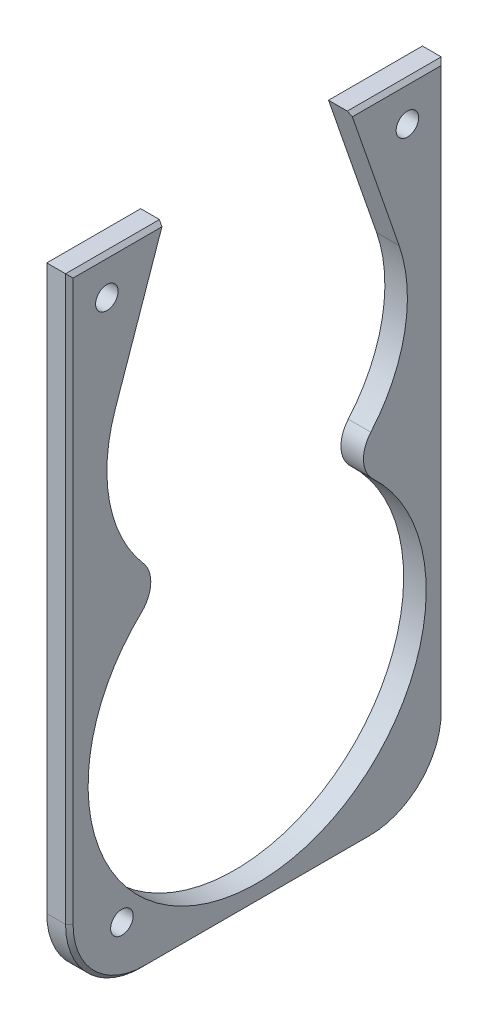
ISO-10303-21;
HEADER;
FILE_DESCRIPTION(('STEP AP214'),'2;1');
FILE_NAME('part.step','',(''),(''),'','','');
FILE_SCHEMA(('AUTOMOTIVE_DESIGN { 1 0 10303 214 1 1 1 1 }'));
ENDSEC;
DATA;
#1=APPLICATION_CONTEXT('core data for automotive mechanical design processes');
#2=APPLICATION_PROTOCOL_DEFINITION('international standard','automotive_design',2000,#1);
#3=PRODUCT_CONTEXT('',#1,'mechanical');
#4=PRODUCT('Part','Part','',(#3));
#5=PRODUCT_RELATED_PRODUCT_CATEGORY('part','',(#4));
#6=PRODUCT_DEFINITION_FORMATION('','',#4);
#7=PRODUCT_DEFINITION_CONTEXT('part definition',#1,'design');
#8=PRODUCT_DEFINITION('design','',#6,#7);
#9=PRODUCT_DEFINITION_SHAPE('','',#8);
#10=(LENGTH_UNIT() NAMED_UNIT(*) SI_UNIT(.MILLI.,.METRE.));
#11=(NAMED_UNIT(*) PLANE_ANGLE_UNIT() SI_UNIT($,.RADIAN.));
#12=(NAMED_UNIT(*) SI_UNIT($,.STERADIAN.) SOLID_ANGLE_UNIT());
#13=UNCERTAINTY_MEASURE_WITH_UNIT(LENGTH_MEASURE(1.E-05),#10,'distance_accuracy_value','');
#14=(GEOMETRIC_REPRESENTATION_CONTEXT(3) GLOBAL_UNCERTAINTY_ASSIGNED_CONTEXT((#13)) GLOBAL_UNIT_ASSIGNED_CONTEXT((#10,
#11,#12)) REPRESENTATION_CONTEXT('',''));
#15=CARTESIAN_POINT('',(0.,0.,0.));
#16=DIRECTION('',(0.,0.,1.));
#17=DIRECTION('',(1.,0.,0.));
#18=AXIS2_PLACEMENT_3D('',#15,#16,#17);
#19=CARTESIAN_POINT('',(0.,25.,0.));
#20=DIRECTION('',(1.,0.,0.));
#21=DIRECTION('',(0.,0.,-1.));
#22=AXIS2_PLACEMENT_3D('',#19,#20,#21);
#23=CYLINDRICAL_SURFACE('',#22,20.);
#24=CARTESIAN_POINT('',(0.,25.,0.));
#25=DIRECTION('',(1.,0.,0.));
#26=DIRECTION('',(0.,0.,-1.));
#27=AXIS2_PLACEMENT_3D('',#24,#25,#26);
#28=CIRCLE('',#27,20.);
#29=CARTESIAN_POINT('',(0.,11.9196428571429,-15.1295821824433));
#30=VERTEX_POINT('',#29);
#31=CARTESIAN_POINT('',(0.,31.5518002592747,-18.8963994814506));
#32=VERTEX_POINT('',#31);
#33=EDGE_CURVE('E195',#30,#32,#28,.T.);
#34=ORIENTED_EDGE('',*,*,#33,.F.);
#35=DIRECTION('',(1.,0.,0.));
#36=VECTOR('',#35,1.);
#37=CARTESIAN_POINT('',(0.,11.9196428571429,-15.1295821824433));
#38=LINE('',#37,#36);
#39=CARTESIAN_POINT('',(3.,11.9196428571429,-15.1295821824433));
#40=VERTEX_POINT('',#39);
#41=EDGE_CURVE('E11',#30,#40,#38,.T.);
#42=ORIENTED_EDGE('',*,*,#41,.T.);
#43=CARTESIAN_POINT('',(3.,25.,0.));
#44=DIRECTION('',(1.,0.,0.));
#45=DIRECTION('',(0.,0.,-1.));
#46=AXIS2_PLACEMENT_3D('',#43,#44,#45);
#47=CIRCLE('',#46,20.);
#48=CARTESIAN_POINT('',(3.,31.5518002592747,-18.8963994814506));
#49=VERTEX_POINT('',#48);
#50=EDGE_CURVE('E218',#40,#49,#47,.T.);
#51=ORIENTED_EDGE('',*,*,#50,.T.);
#52=DIRECTION('',(1.,0.,0.));
#53=VECTOR('',#52,1.);
#54=CARTESIAN_POINT('',(0.,31.5518002592747,-18.8963994814506));
#55=LINE('',#54,#53);
#56=EDGE_CURVE('E184',#32,#49,#55,.T.);
#57=ORIENTED_EDGE('',*,*,#56,.F.);
#58=EDGE_LOOP('',(#34,#42,#51,#57));
#59=FACE_BOUND('',#58,.T.);
#60=ADVANCED_FACE('F47',(#59),#23,.F.);
#61=CARTESIAN_POINT('',(3.,50.,25.));
#62=DIRECTION('',(0.,-1.,0.));
#63=DIRECTION('',(0.,0.,-1.));
#64=AXIS2_PLACEMENT_3D('',#61,#62,#63);
#65=PLANE('',#64);
#66=DIRECTION('',(0.,0.,-1.));
#67=VECTOR('',#66,1.);
#68=CARTESIAN_POINT('',(2.49999999999999,50.,-25.));
#69=LINE('',#68,#67);
#70=CARTESIAN_POINT('',(2.49999999999999,50.,25.));
#71=VERTEX_POINT('',#70);
#72=CARTESIAN_POINT('',(2.49999999999999,50.,12.5));
#73=VERTEX_POINT('',#72);
#74=EDGE_CURVE('E336',#71,#73,#69,.T.);
#75=ORIENTED_EDGE('',*,*,#74,.T.);
#76=DIRECTION('',(1.,0.,0.));
#77=VECTOR('',#76,1.);
#78=CARTESIAN_POINT('',(0.,50.,12.5));
#79=LINE('',#78,#77);
#80=CARTESIAN_POINT('',(0.,50.,12.5));
#81=VERTEX_POINT('',#80);
#82=EDGE_CURVE('E222',#81,#73,#79,.T.);
#83=ORIENTED_EDGE('',*,*,#82,.F.);
#84=DIRECTION('',(0.,0.,1.));
#85=VECTOR('',#84,1.);
#86=CARTESIAN_POINT('',(0.,50.,25.));
#87=LINE('',#86,#85);
#88=CARTESIAN_POINT('',(0.,50.,25.));
#89=VERTEX_POINT('',#88);
#90=EDGE_CURVE('E201',#81,#89,#87,.T.);
#91=ORIENTED_EDGE('',*,*,#90,.T.);
#92=DIRECTION('',(-1.,0.,0.));
#93=VECTOR('',#92,1.);
#94=CARTESIAN_POINT('',(3.,50.,25.));
#95=LINE('',#94,#93);
#96=EDGE_CURVE('E274',#71,#89,#95,.T.);
#97=ORIENTED_EDGE('',*,*,#96,.F.);
#98=EDGE_LOOP('',(#75,#83,#91,#97));
#99=FACE_BOUND('',#98,.T.);
#100=ADVANCED_FACE('F461',(#99),#65,.F.);
#101=CARTESIAN_POINT('',(3.,49.5,0.));
#102=DIRECTION('',(0.707106781186535,0.70710678118656,0.));
#103=DIRECTION('',(0.,0.,-1.));
#104=AXIS2_PLACEMENT_3D('',#101,#102,#103);
#105=PLANE('',#104);
#106=DIRECTION('',(0.686767793950055,-0.686767793950032,0.238117606207481));
#107=VECTOR('',#106,1.);
#108=CARTESIAN_POINT('',(0.927506213859762,51.5724937861402,11.954781573291));
#109=LINE('',#108,#107);
#110=CARTESIAN_POINT('',(3.,49.5,12.6733610751007));
#111=VERTEX_POINT('',#110);
#112=EDGE_CURVE('E366',#73,#111,#109,.T.);
#113=ORIENTED_EDGE('',*,*,#112,.F.);
#114=ORIENTED_EDGE('',*,*,#74,.F.);
#115=DIRECTION('',(-0.577350269189638,0.577350269189618,0.577350269189621));
#116=VECTOR('',#115,1.);
#117=CARTESIAN_POINT('',(19.5000000000001,33.0000000000005,8.00000000000035));
#118=LINE('',#117,#116);
#119=CARTESIAN_POINT('',(3.,49.5,24.5));
#120=VERTEX_POINT('',#119);
#121=EDGE_CURVE('E349',#71,#120,#118,.F.);
#122=ORIENTED_EDGE('',*,*,#121,.T.);
#123=DIRECTION('',(0.,0.,1.));
#124=VECTOR('',#123,1.);
#125=CARTESIAN_POINT('',(3.,49.5,25.));
#126=LINE('',#125,#124);
#127=EDGE_CURVE('E304',#111,#120,#126,.T.);
#128=ORIENTED_EDGE('',*,*,#127,.F.);
#129=EDGE_LOOP('',(#113,#114,#122,#128));
#130=FACE_BOUND('',#129,.T.);
#131=ADVANCED_FACE('F468',(#130),#105,.T.);
#132=CARTESIAN_POINT('',(3.,50.,25.));
#133=DIRECTION('',(0.,0.,-1.));
#134=DIRECTION('',(0.,1.,0.));
#135=AXIS2_PLACEMENT_3D('',#132,#133,#134);
#136=PLANE('',#135);
#137=DIRECTION('',(-1.,0.,0.));
#138=VECTOR('',#137,1.);
#139=CARTESIAN_POINT('',(3.,-25.,25.));
#140=LINE('',#139,#138);
#141=CARTESIAN_POINT('',(0.,-25.,25.));
#142=VERTEX_POINT('',#141);
#143=CARTESIAN_POINT('',(2.49999999999999,-25.,25.));
#144=VERTEX_POINT('',#143);
#145=EDGE_CURVE('E297',#142,#144,#140,.F.);
#146=ORIENTED_EDGE('',*,*,#145,.T.);
#147=DIRECTION('',(0.,1.,0.));
#148=VECTOR('',#147,1.);
#149=CARTESIAN_POINT('',(2.49999999999999,50.,25.));
#150=LINE('',#149,#148);
#151=EDGE_CURVE('E340',#144,#71,#150,.T.);
#152=ORIENTED_EDGE('',*,*,#151,.T.);
#153=ORIENTED_EDGE('',*,*,#96,.T.);
#154=DIRECTION('',(0.,-1.,0.));
#155=VECTOR('',#154,1.);
#156=CARTESIAN_POINT('',(0.,50.,25.));
#157=LINE('',#156,#155);
#158=EDGE_CURVE('E237',#89,#142,#157,.T.);
#159=ORIENTED_EDGE('',*,*,#158,.T.);
#160=EDGE_LOOP('',(#146,#152,#153,#159));
#161=FACE_BOUND('',#160,.T.);
#162=ADVANCED_FACE('F459',(#161),#136,.F.);
#163=CARTESIAN_POINT('',(3.,-35.,25.));
#164=DIRECTION('',(0.,1.,0.));
#165=DIRECTION('',(0.,0.,1.));
#166=AXIS2_PLACEMENT_3D('',#163,#164,#165);
#167=PLANE('',#166);
#168=DIRECTION('',(-1.,0.,0.));
#169=VECTOR('',#168,1.);
#170=CARTESIAN_POINT('',(3.,-35.,-15.));
#171=LINE('',#170,#169);
#172=CARTESIAN_POINT('',(0.,-35.,-15.));
#173=VERTEX_POINT('',#172);
#174=CARTESIAN_POINT('',(2.49999999999999,-35.,-15.));
#175=VERTEX_POINT('',#174);
#176=EDGE_CURVE('E293',#173,#175,#171,.F.);
#177=ORIENTED_EDGE('',*,*,#176,.T.);
#178=DIRECTION('',(0.,0.,1.));
#179=VECTOR('',#178,1.);
#180=CARTESIAN_POINT('',(2.49999999999999,-35.,15.));
#181=LINE('',#180,#179);
#182=CARTESIAN_POINT('',(2.49999999999999,-35.,15.));
#183=VERTEX_POINT('',#182);
#184=EDGE_CURVE('E329',#175,#183,#181,.T.);
#185=ORIENTED_EDGE('',*,*,#184,.T.);
#186=DIRECTION('',(-1.,0.,0.));
#187=VECTOR('',#186,1.);
#188=CARTESIAN_POINT('',(3.,-35.,15.));
#189=LINE('',#188,#187);
#190=CARTESIAN_POINT('',(0.,-35.,15.));
#191=VERTEX_POINT('',#190);
#192=EDGE_CURVE('E290',#183,#191,#189,.T.);
#193=ORIENTED_EDGE('',*,*,#192,.T.);
#194=DIRECTION('',(0.,0.,-1.));
#195=VECTOR('',#194,1.);
#196=CARTESIAN_POINT('',(0.,-35.,25.));
#197=LINE('',#196,#195);
#198=EDGE_CURVE('E262',#191,#173,#197,.T.);
#199=ORIENTED_EDGE('',*,*,#198,.T.);
#200=EDGE_LOOP('',(#177,#185,#193,#199));
#201=FACE_BOUND('',#200,.T.);
#202=ADVANCED_FACE('F420',(#201),#167,.F.);
#203=CARTESIAN_POINT('',(3.,50.,-25.));
#204=DIRECTION('',(0.,0.,1.));
#205=DIRECTION('',(0.,-1.,0.));
#206=AXIS2_PLACEMENT_3D('',#203,#204,#205);
#207=PLANE('',#206);
#208=DIRECTION('',(-1.,0.,0.));
#209=VECTOR('',#208,1.);
#210=CARTESIAN_POINT('',(3.,50.,-25.));
#211=LINE('',#210,#209);
#212=CARTESIAN_POINT('',(2.49999999999999,50.,-25.));
#213=VERTEX_POINT('',#212);
#214=CARTESIAN_POINT('',(0.,50.,-25.));
#215=VERTEX_POINT('',#214);
#216=EDGE_CURVE('E278',#213,#215,#211,.T.);
#217=ORIENTED_EDGE('',*,*,#216,.F.);
#218=DIRECTION('',(0.,-1.,0.));
#219=VECTOR('',#218,1.);
#220=CARTESIAN_POINT('',(2.49999999999999,-25.,-25.));
#221=LINE('',#220,#219);
#222=CARTESIAN_POINT('',(2.49999999999999,-25.,-25.));
#223=VERTEX_POINT('',#222);
#224=EDGE_CURVE('E322',#213,#223,#221,.T.);
#225=ORIENTED_EDGE('',*,*,#224,.T.);
#226=DIRECTION('',(-1.,0.,0.));
#227=VECTOR('',#226,1.);
#228=CARTESIAN_POINT('',(3.,-25.,-25.));
#229=LINE('',#228,#227);
#230=CARTESIAN_POINT('',(0.,-25.,-25.));
#231=VERTEX_POINT('',#230);
#232=EDGE_CURVE('E281',#223,#231,#229,.T.);
#233=ORIENTED_EDGE('',*,*,#232,.T.);
#234=DIRECTION('',(0.,1.,0.));
#235=VECTOR('',#234,1.);
#236=CARTESIAN_POINT('',(0.,50.,-25.));
#237=LINE('',#236,#235);
#238=EDGE_CURVE('E266',#231,#215,#237,.T.);
#239=ORIENTED_EDGE('',*,*,#238,.T.);
#240=EDGE_LOOP('',(#217,#225,#233,#239));
#241=FACE_BOUND('',#240,.T.);
#242=ADVANCED_FACE('F413',(#241),#207,.F.);
#243=CARTESIAN_POINT('',(0.,50.,-12.5));
#244=VERTEX_POINT('',#243);
#245=EDGE_CURVE('E270',#215,#244,#87,.T.);
#246=ORIENTED_EDGE('',*,*,#245,.T.);
#247=DIRECTION('',(1.,0.,0.));
#248=VECTOR('',#247,1.);
#249=CARTESIAN_POINT('',(0.,50.,-12.5));
#250=LINE('',#249,#248);
#251=CARTESIAN_POINT('',(2.49999999999999,50.,-12.5));
#252=VERTEX_POINT('',#251);
#253=EDGE_CURVE('E226',#244,#252,#250,.T.);
#254=ORIENTED_EDGE('',*,*,#253,.T.);
#255=EDGE_CURVE('E335',#252,#213,#69,.T.);
#256=ORIENTED_EDGE('',*,*,#255,.T.);
#257=ORIENTED_EDGE('',*,*,#216,.T.);
#258=EDGE_LOOP('',(#246,#254,#256,#257));
#259=FACE_BOUND('',#258,.T.);
#260=ADVANCED_FACE('F408',(#259),#65,.F.);
#261=CARTESIAN_POINT('',(3.,0.,0.));
#262=DIRECTION('',(1.,0.,0.));
#263=DIRECTION('',(0.,0.,-1.));
#264=AXIS2_PLACEMENT_3D('',#261,#262,#263);
#265=PLANE('',#264);
#266=CARTESIAN_POINT('',(3.,-10.,0.));
#267=DIRECTION('',(1.,0.,0.));
#268=DIRECTION('',(0.,0.,-1.));
#269=AXIS2_PLACEMENT_3D('',#266,#267,#268);
#270=CIRCLE('',#269,22.5);
#271=CARTESIAN_POINT('',(3.,6.38982479784366,15.4150459972064));
#272=VERTEX_POINT('',#271);
#273=CARTESIAN_POINT('',(3.,6.38982479784367,-15.4150459972064));
#274=VERTEX_POINT('',#273);
#275=EDGE_CURVE('E210',#272,#274,#270,.T.);
#276=ORIENTED_EDGE('',*,*,#275,.F.);
#277=CARTESIAN_POINT('',(3.,9.30357142857142,18.155498618932));
#278=DIRECTION('',(1.,0.,0.));
#279=DIRECTION('',(0.,0.,-1.));
#280=AXIS2_PLACEMENT_3D('',#277,#278,#279);
#281=CIRCLE('',#280,4.);
#282=CARTESIAN_POINT('',(3.,11.9196428571429,15.1295821824433));
#283=VERTEX_POINT('',#282);
#284=EDGE_CURVE('E56',#272,#283,#281,.T.);
#285=ORIENTED_EDGE('',*,*,#284,.T.);
#286=CARTESIAN_POINT('',(3.,31.5518002592747,18.8963994814507));
#287=VERTEX_POINT('',#286);
#288=EDGE_CURVE('E207',#287,#283,#47,.T.);
#289=ORIENTED_EDGE('',*,*,#288,.F.);
#290=DIRECTION('',(0.,-0.944819974072532,0.327590012963734));
#291=VECTOR('',#290,1.);
#292=CARTESIAN_POINT('',(3.,50.,12.5));
#293=LINE('',#292,#291);
#294=EDGE_CURVE('E179',#111,#287,#293,.T.);
#295=ORIENTED_EDGE('',*,*,#294,.F.);
#296=ORIENTED_EDGE('',*,*,#127,.T.);
#297=DIRECTION('',(0.,-1.,0.));
#298=VECTOR('',#297,1.);
#299=CARTESIAN_POINT('',(3.,-25.,24.5));
#300=LINE('',#299,#298);
#301=CARTESIAN_POINT('',(3.,-25.,24.5));
#302=VERTEX_POINT('',#301);
#303=EDGE_CURVE('E301',#120,#302,#300,.T.);
#304=ORIENTED_EDGE('',*,*,#303,.T.);
#305=CARTESIAN_POINT('',(3.,-25.,15.));
#306=DIRECTION('',(1.,0.,0.));
#307=DIRECTION('',(0.,0.,-1.));
#308=AXIS2_PLACEMENT_3D('',#305,#306,#307);
#309=CIRCLE('',#308,9.5);
#310=CARTESIAN_POINT('',(3.,-34.5,15.));
#311=VERTEX_POINT('',#310);
#312=EDGE_CURVE('E309',#302,#311,#309,.T.);
#313=ORIENTED_EDGE('',*,*,#312,.T.);
#314=DIRECTION('',(0.,0.,-1.));
#315=VECTOR('',#314,1.);
#316=CARTESIAN_POINT('',(3.,-34.5,-15.));
#317=LINE('',#316,#315);
#318=CARTESIAN_POINT('',(3.,-34.5,-15.));
#319=VERTEX_POINT('',#318);
#320=EDGE_CURVE('E312',#311,#319,#317,.T.);
#321=ORIENTED_EDGE('',*,*,#320,.T.);
#322=CARTESIAN_POINT('',(3.,-25.,-15.));
#323=DIRECTION('',(1.,0.,0.));
#324=DIRECTION('',(0.,0.,-1.));
#325=AXIS2_PLACEMENT_3D('',#322,#323,#324);
#326=CIRCLE('',#325,9.5);
#327=CARTESIAN_POINT('',(3.,-25.,-24.5));
#328=VERTEX_POINT('',#327);
#329=EDGE_CURVE('E315',#319,#328,#326,.T.);
#330=ORIENTED_EDGE('',*,*,#329,.T.);
#331=DIRECTION('',(0.,1.,0.));
#332=VECTOR('',#331,1.);
#333=CARTESIAN_POINT('',(3.,50.,-24.5));
#334=LINE('',#333,#332);
#335=CARTESIAN_POINT('',(3.,49.5,-24.5));
#336=VERTEX_POINT('',#335);
#337=EDGE_CURVE('E318',#328,#336,#334,.T.);
#338=ORIENTED_EDGE('',*,*,#337,.T.);
#339=CARTESIAN_POINT('',(3.,49.5,-12.6733610751007));
#340=VERTEX_POINT('',#339);
#341=EDGE_CURVE('E305',#336,#340,#126,.T.);
#342=ORIENTED_EDGE('',*,*,#341,.T.);
#343=DIRECTION('',(0.,0.944819974072532,0.327590012963734));
#344=VECTOR('',#343,1.);
#345=CARTESIAN_POINT('',(3.,31.5518002592747,-18.8963994814506));
#346=LINE('',#345,#344);
#347=EDGE_CURVE('E203',#49,#340,#346,.T.);
#348=ORIENTED_EDGE('',*,*,#347,.F.);
#349=ORIENTED_EDGE('',*,*,#50,.F.);
#350=CARTESIAN_POINT('',(3.,9.30357142857143,-18.155498618932));
#351=DIRECTION('',(1.,0.,0.));
#352=DIRECTION('',(0.,0.,-1.));
#353=AXIS2_PLACEMENT_3D('',#350,#351,#352);
#354=CIRCLE('',#353,4.);
#355=EDGE_CURVE('E63',#40,#274,#354,.T.);
#356=ORIENTED_EDGE('',*,*,#355,.T.);
#357=EDGE_LOOP('',(#276,#285,#289,#295,#296,#304,#313,#321,#330,#338,#342,#348,#349,#356));
#358=FACE_BOUND('',#357,.T.);
#359=CARTESIAN_POINT('',(3.,45.,-20.));
#360=DIRECTION('',(1.,0.,0.));
#361=DIRECTION('',(0.,0.,-1.));
#362=AXIS2_PLACEMENT_3D('',#359,#360,#361);
#363=CIRCLE('',#362,1.5);
#364=CARTESIAN_POINT('',(3.,45.,-21.5));
#365=VERTEX_POINT('',#364);
#366=EDGE_CURVE('E238',#365,#365,#363,.T.);
#367=ORIENTED_EDGE('',*,*,#366,.F.);
#368=EDGE_LOOP('',(#367));
#369=FACE_BOUND('',#368,.T.);
#370=CARTESIAN_POINT('',(3.,45.,20.));
#371=DIRECTION('',(1.,0.,0.));
#372=DIRECTION('',(0.,0.,-1.));
#373=AXIS2_PLACEMENT_3D('',#370,#371,#372);
#374=CIRCLE('',#373,1.5);
#375=CARTESIAN_POINT('',(3.,45.,18.5));
#376=VERTEX_POINT('',#375);
#377=EDGE_CURVE('E242',#376,#376,#374,.T.);
#378=ORIENTED_EDGE('',*,*,#377,.F.);
#379=EDGE_LOOP('',(#378));
#380=FACE_BOUND('',#379,.T.);
#381=CARTESIAN_POINT('',(3.,-28.,18.));
#382=DIRECTION('',(1.,0.,0.));
#383=DIRECTION('',(0.,0.,-1.));
#384=AXIS2_PLACEMENT_3D('',#381,#382,#383);
#385=CIRCLE('',#384,1.5);
#386=CARTESIAN_POINT('',(3.,-28.,16.5));
#387=VERTEX_POINT('',#386);
#388=EDGE_CURVE('E250',#387,#387,#385,.T.);
#389=ORIENTED_EDGE('',*,*,#388,.F.);
#390=EDGE_LOOP('',(#389));
#391=FACE_BOUND('',#390,.T.);
#392=ADVANCED_FACE('F386',(#358,#369,#380,#391),#265,.T.);
#393=CARTESIAN_POINT('',(0.,0.,0.));
#394=DIRECTION('',(1.,0.,0.));
#395=DIRECTION('',(0.,0.,-1.));
#396=AXIS2_PLACEMENT_3D('',#393,#394,#395);
#397=PLANE('',#396);
#398=CARTESIAN_POINT('',(0.,31.5518002592747,18.8963994814507));
#399=VERTEX_POINT('',#398);
#400=CARTESIAN_POINT('',(0.,11.9196428571429,15.1295821824433));
#401=VERTEX_POINT('',#400);
#402=EDGE_CURVE('E189',#399,#401,#28,.T.);
#403=ORIENTED_EDGE('',*,*,#402,.T.);
#404=CARTESIAN_POINT('',(0.,9.30357142857142,18.155498618932));
#405=DIRECTION('',(1.,0.,0.));
#406=DIRECTION('',(0.,0.,-1.));
#407=AXIS2_PLACEMENT_3D('',#404,#405,#406);
#408=CIRCLE('',#407,4.);
#409=CARTESIAN_POINT('',(0.,6.38982479784366,15.4150459972064));
#410=VERTEX_POINT('',#409);
#411=EDGE_CURVE('E374',#401,#410,#408,.F.);
#412=ORIENTED_EDGE('',*,*,#411,.T.);
#413=CARTESIAN_POINT('',(0.,-10.,0.));
#414=DIRECTION('',(1.,0.,0.));
#415=DIRECTION('',(0.,0.,-1.));
#416=AXIS2_PLACEMENT_3D('',#413,#414,#415);
#417=CIRCLE('',#416,22.5);
#418=CARTESIAN_POINT('',(0.,6.38982479784367,-15.4150459972064));
#419=VERTEX_POINT('',#418);
#420=EDGE_CURVE('E219',#410,#419,#417,.T.);
#421=ORIENTED_EDGE('',*,*,#420,.T.);
#422=CARTESIAN_POINT('',(0.,9.30357142857143,-18.155498618932));
#423=DIRECTION('',(1.,0.,0.));
#424=DIRECTION('',(0.,0.,-1.));
#425=AXIS2_PLACEMENT_3D('',#422,#423,#424);
#426=CIRCLE('',#425,4.);
#427=EDGE_CURVE('E371',#419,#30,#426,.F.);
#428=ORIENTED_EDGE('',*,*,#427,.T.);
#429=ORIENTED_EDGE('',*,*,#33,.T.);
#430=DIRECTION('',(0.,0.944819974072532,0.327590012963734));
#431=VECTOR('',#430,1.);
#432=CARTESIAN_POINT('',(0.,31.5518002592747,-18.8963994814506));
#433=LINE('',#432,#431);
#434=EDGE_CURVE('E185',#32,#244,#433,.T.);
#435=ORIENTED_EDGE('',*,*,#434,.T.);
#436=ORIENTED_EDGE('',*,*,#245,.F.);
#437=ORIENTED_EDGE('',*,*,#238,.F.);
#438=CARTESIAN_POINT('',(0.,-25.,-15.));
#439=DIRECTION('',(1.,0.,0.));
#440=DIRECTION('',(0.,0.,-1.));
#441=AXIS2_PLACEMENT_3D('',#438,#439,#440);
#442=CIRCLE('',#441,10.);
#443=EDGE_CURVE('E287',#231,#173,#442,.F.);
#444=ORIENTED_EDGE('',*,*,#443,.T.);
#445=ORIENTED_EDGE('',*,*,#198,.F.);
#446=CARTESIAN_POINT('',(0.,-25.,15.));
#447=DIRECTION('',(1.,0.,0.));
#448=DIRECTION('',(0.,0.,-1.));
#449=AXIS2_PLACEMENT_3D('',#446,#447,#448);
#450=CIRCLE('',#449,10.);
#451=EDGE_CURVE('E284',#191,#142,#450,.F.);
#452=ORIENTED_EDGE('',*,*,#451,.T.);
#453=ORIENTED_EDGE('',*,*,#158,.F.);
#454=ORIENTED_EDGE('',*,*,#90,.F.);
#455=DIRECTION('',(0.,-0.944819974072532,0.327590012963734));
#456=VECTOR('',#455,1.);
#457=CARTESIAN_POINT('',(0.,50.,12.5));
#458=LINE('',#457,#456);
#459=EDGE_CURVE('E176',#81,#399,#458,.T.);
#460=ORIENTED_EDGE('',*,*,#459,.T.);
#461=EDGE_LOOP('',(#403,#412,#421,#428,#429,#435,#436,#437,#444,#445,#452,#453,#454,#460));
#462=FACE_BOUND('',#461,.T.);
#463=CARTESIAN_POINT('',(0.,45.,-20.));
#464=DIRECTION('',(1.,0.,0.));
#465=DIRECTION('',(0.,0.,-1.));
#466=AXIS2_PLACEMENT_3D('',#463,#464,#465);
#467=CIRCLE('',#466,1.5);
#468=CARTESIAN_POINT('',(0.,45.,-21.5));
#469=VERTEX_POINT('',#468);
#470=EDGE_CURVE('E233',#469,#469,#467,.T.);
#471=ORIENTED_EDGE('',*,*,#470,.T.);
#472=EDGE_LOOP('',(#471));
#473=FACE_BOUND('',#472,.T.);
#474=CARTESIAN_POINT('',(0.,45.,20.));
#475=DIRECTION('',(1.,0.,0.));
#476=DIRECTION('',(0.,0.,-1.));
#477=AXIS2_PLACEMENT_3D('',#474,#475,#476);
#478=CIRCLE('',#477,1.5);
#479=CARTESIAN_POINT('',(0.,45.,18.5));
#480=VERTEX_POINT('',#479);
#481=EDGE_CURVE('E246',#480,#480,#478,.T.);
#482=ORIENTED_EDGE('',*,*,#481,.T.);
#483=EDGE_LOOP('',(#482));
#484=FACE_BOUND('',#483,.T.);
#485=CARTESIAN_POINT('',(0.,-28.,18.));
#486=DIRECTION('',(1.,0.,0.));
#487=DIRECTION('',(0.,0.,-1.));
#488=AXIS2_PLACEMENT_3D('',#485,#486,#487);
#489=CIRCLE('',#488,1.5);
#490=CARTESIAN_POINT('',(0.,-28.,16.5));
#491=VERTEX_POINT('',#490);
#492=EDGE_CURVE('E254',#491,#491,#489,.T.);
#493=ORIENTED_EDGE('',*,*,#492,.T.);
#494=EDGE_LOOP('',(#493));
#495=FACE_BOUND('',#494,.T.);
#496=ADVANCED_FACE('F198',(#462,#473,#484,#495),#397,.F.);
#497=CARTESIAN_POINT('',(3.,-25.,-15.));
#498=DIRECTION('',(-1.,0.,0.));
#499=DIRECTION('',(0.,0.,1.));
#500=AXIS2_PLACEMENT_3D('',#497,#498,#499);
#501=CYLINDRICAL_SURFACE('',#500,10.);
#502=ORIENTED_EDGE('',*,*,#232,.F.);
#503=CARTESIAN_POINT('',(2.49999999999999,-25.,-15.));
#504=DIRECTION('',(1.,0.,0.));
#505=DIRECTION('',(0.,0.,-1.));
#506=AXIS2_PLACEMENT_3D('',#503,#504,#505);
#507=CIRCLE('',#506,10.);
#508=EDGE_CURVE('E326',#223,#175,#507,.F.);
#509=ORIENTED_EDGE('',*,*,#508,.T.);
#510=ORIENTED_EDGE('',*,*,#176,.F.);
#511=ORIENTED_EDGE('',*,*,#443,.F.);
#512=EDGE_LOOP('',(#502,#509,#510,#511));
#513=FACE_BOUND('',#512,.T.);
#514=ADVANCED_FACE('F424',(#513),#501,.T.);
#515=CARTESIAN_POINT('',(3.,-25.,15.));
#516=DIRECTION('',(-1.,0.,0.));
#517=DIRECTION('',(0.,0.,1.));
#518=AXIS2_PLACEMENT_3D('',#515,#516,#517);
#519=CYLINDRICAL_SURFACE('',#518,10.);
#520=ORIENTED_EDGE('',*,*,#192,.F.);
#521=CARTESIAN_POINT('',(2.49999999999999,-25.,15.));
#522=DIRECTION('',(1.,0.,0.));
#523=DIRECTION('',(0.,0.,-1.));
#524=AXIS2_PLACEMENT_3D('',#521,#522,#523);
#525=CIRCLE('',#524,10.);
#526=EDGE_CURVE('E332',#183,#144,#525,.F.);
#527=ORIENTED_EDGE('',*,*,#526,.T.);
#528=ORIENTED_EDGE('',*,*,#145,.F.);
#529=ORIENTED_EDGE('',*,*,#451,.F.);
#530=EDGE_LOOP('',(#520,#527,#528,#529));
#531=FACE_BOUND('',#530,.T.);
#532=ADVANCED_FACE('F446',(#531),#519,.T.);
#533=CARTESIAN_POINT('',(0.,-28.,18.));
#534=DIRECTION('',(1.,0.,0.));
#535=DIRECTION('',(0.,0.,-1.));
#536=AXIS2_PLACEMENT_3D('',#533,#534,#535);
#537=CYLINDRICAL_SURFACE('',#536,1.5);
#538=ORIENTED_EDGE('',*,*,#492,.F.);
#539=EDGE_LOOP('',(#538));
#540=FACE_BOUND('',#539,.T.);
#541=ORIENTED_EDGE('',*,*,#388,.T.);
#542=EDGE_LOOP('',(#541));
#543=FACE_BOUND('',#542,.T.);
#544=ADVANCED_FACE('F510',(#540,#543),#537,.F.);
#545=CARTESIAN_POINT('',(0.,45.,20.));
#546=DIRECTION('',(1.,0.,0.));
#547=DIRECTION('',(0.,0.,-1.));
#548=AXIS2_PLACEMENT_3D('',#545,#546,#547);
#549=CYLINDRICAL_SURFACE('',#548,1.5);
#550=ORIENTED_EDGE('',*,*,#481,.F.);
#551=EDGE_LOOP('',(#550));
#552=FACE_BOUND('',#551,.T.);
#553=ORIENTED_EDGE('',*,*,#377,.T.);
#554=EDGE_LOOP('',(#553));
#555=FACE_BOUND('',#554,.T.);
#556=ADVANCED_FACE('F506',(#552,#555),#549,.F.);
#557=CARTESIAN_POINT('',(0.,45.,-20.));
#558=DIRECTION('',(1.,0.,0.));
#559=DIRECTION('',(0.,0.,-1.));
#560=AXIS2_PLACEMENT_3D('',#557,#558,#559);
#561=CYLINDRICAL_SURFACE('',#560,1.5);
#562=ORIENTED_EDGE('',*,*,#470,.F.);
#563=EDGE_LOOP('',(#562));
#564=FACE_BOUND('',#563,.T.);
#565=ORIENTED_EDGE('',*,*,#366,.T.);
#566=EDGE_LOOP('',(#565));
#567=FACE_BOUND('',#566,.T.);
#568=ADVANCED_FACE('F503',(#564,#567),#561,.F.);
#569=CARTESIAN_POINT('',(3.,-25.,15.));
#570=DIRECTION('',(-1.,0.,0.));
#571=DIRECTION('',(0.,0.,1.));
#572=AXIS2_PLACEMENT_3D('',#569,#570,#571);
#573=CONICAL_SURFACE('',#572,9.5,0.785398163397435);
#574=DIRECTION('',(0.707106781186557,0.,-0.707106781186538));
#575=VECTOR('',#574,1.);
#576=CARTESIAN_POINT('',(2.49999999999999,-25.,25.));
#577=LINE('',#576,#575);
#578=EDGE_CURVE('E357',#144,#302,#577,.T.);
#579=ORIENTED_EDGE('',*,*,#578,.F.);
#580=ORIENTED_EDGE('',*,*,#526,.F.);
#581=DIRECTION('',(-0.707106781186557,-0.707106781186538,0.));
#582=VECTOR('',#581,1.);
#583=CARTESIAN_POINT('',(3.,-34.5,15.));
#584=LINE('',#583,#582);
#585=EDGE_CURVE('E258',#311,#183,#584,.T.);
#586=ORIENTED_EDGE('',*,*,#585,.F.);
#587=ORIENTED_EDGE('',*,*,#312,.F.);
#588=EDGE_LOOP('',(#579,#580,#586,#587));
#589=FACE_BOUND('',#588,.T.);
#590=ADVANCED_FACE('F450',(#589),#573,.T.);
#591=CARTESIAN_POINT('',(3.,-34.5,0.));
#592=DIRECTION('',(0.707106781186538,-0.707106781186557,0.));
#593=DIRECTION('',(0.,0.,1.));
#594=AXIS2_PLACEMENT_3D('',#591,#592,#593);
#595=PLANE('',#594);
#596=ORIENTED_EDGE('',*,*,#585,.T.);
#597=ORIENTED_EDGE('',*,*,#184,.F.);
#598=DIRECTION('',(-0.707106781186557,-0.707106781186538,0.));
#599=VECTOR('',#598,1.);
#600=CARTESIAN_POINT('',(3.,-34.5,-15.));
#601=LINE('',#600,#599);
#602=EDGE_CURVE('E353',#319,#175,#601,.T.);
#603=ORIENTED_EDGE('',*,*,#602,.F.);
#604=ORIENTED_EDGE('',*,*,#320,.F.);
#605=EDGE_LOOP('',(#596,#597,#603,#604));
#606=FACE_BOUND('',#605,.T.);
#607=ADVANCED_FACE('F443',(#606),#595,.T.);
#608=CARTESIAN_POINT('',(3.,0.,24.5));
#609=DIRECTION('',(0.707106781186537,0.,0.707106781186558));
#610=DIRECTION('',(0.,1.,0.));
#611=AXIS2_PLACEMENT_3D('',#608,#609,#610);
#612=PLANE('',#611);
#613=ORIENTED_EDGE('',*,*,#578,.T.);
#614=ORIENTED_EDGE('',*,*,#303,.F.);
#615=ORIENTED_EDGE('',*,*,#121,.F.);
#616=ORIENTED_EDGE('',*,*,#151,.F.);
#617=EDGE_LOOP('',(#613,#614,#615,#616));
#618=FACE_BOUND('',#617,.T.);
#619=ADVANCED_FACE('F455',(#618),#612,.T.);
#620=CARTESIAN_POINT('',(3.,-25.,-15.));
#621=DIRECTION('',(-1.,0.,0.));
#622=DIRECTION('',(0.,0.,1.));
#623=AXIS2_PLACEMENT_3D('',#620,#621,#622);
#624=CONICAL_SURFACE('',#623,9.5,0.785398163397433);
#625=ORIENTED_EDGE('',*,*,#602,.T.);
#626=ORIENTED_EDGE('',*,*,#508,.F.);
#627=DIRECTION('',(-0.707106781186557,0.,-0.707106781186538));
#628=VECTOR('',#627,1.);
#629=CARTESIAN_POINT('',(3.,-25.,-24.5));
#630=LINE('',#629,#628);
#631=EDGE_CURVE('E346',#328,#223,#630,.T.);
#632=ORIENTED_EDGE('',*,*,#631,.F.);
#633=ORIENTED_EDGE('',*,*,#329,.F.);
#634=EDGE_LOOP('',(#625,#626,#632,#633));
#635=FACE_BOUND('',#634,.T.);
#636=ADVANCED_FACE('F428',(#635),#624,.T.);
#637=DIRECTION('',(-0.686767793950055,0.686767793950031,0.238117606207481));
#638=VECTOR('',#637,1.);
#639=CARTESIAN_POINT('',(0.92750621385976,51.5724937861402,-11.954781573291));
#640=LINE('',#639,#638);
#641=EDGE_CURVE('E343',#340,#252,#640,.T.);
#642=ORIENTED_EDGE('',*,*,#641,.F.);
#643=ORIENTED_EDGE('',*,*,#341,.F.);
#644=DIRECTION('',(-0.577350269189638,0.577350269189618,-0.577350269189621));
#645=VECTOR('',#644,1.);
#646=CARTESIAN_POINT('',(11.1666666666668,41.3333333333335,-16.3333333333335));
#647=LINE('',#646,#645);
#648=EDGE_CURVE('E225',#213,#336,#647,.F.);
#649=ORIENTED_EDGE('',*,*,#648,.F.);
#650=ORIENTED_EDGE('',*,*,#255,.F.);
#651=EDGE_LOOP('',(#642,#643,#649,#650));
#652=FACE_BOUND('',#651,.T.);
#653=ADVANCED_FACE('F438',(#652),#105,.T.);
#654=CARTESIAN_POINT('',(3.,0.,-24.5));
#655=DIRECTION('',(0.707106781186537,0.,-0.707106781186558));
#656=DIRECTION('',(0.,-1.,0.));
#657=AXIS2_PLACEMENT_3D('',#654,#655,#656);
#658=PLANE('',#657);
#659=ORIENTED_EDGE('',*,*,#631,.T.);
#660=ORIENTED_EDGE('',*,*,#224,.F.);
#661=ORIENTED_EDGE('',*,*,#648,.T.);
#662=ORIENTED_EDGE('',*,*,#337,.F.);
#663=EDGE_LOOP('',(#659,#660,#661,#662));
#664=FACE_BOUND('',#663,.T.);
#665=ADVANCED_FACE('F434',(#664),#658,.T.);
#666=CARTESIAN_POINT('',(0.,50.,12.5));
#667=DIRECTION('',(0.,0.327590012963734,0.944819974072532));
#668=DIRECTION('',(0.,-0.944819974072532,0.327590012963734));
#669=AXIS2_PLACEMENT_3D('',#666,#667,#668);
#670=PLANE('',#669);
#671=ORIENTED_EDGE('',*,*,#112,.T.);
#672=ORIENTED_EDGE('',*,*,#294,.T.);
#673=DIRECTION('',(1.,0.,0.));
#674=VECTOR('',#673,1.);
#675=CARTESIAN_POINT('',(0.,31.5518002592747,18.8963994814507));
#676=LINE('',#675,#674);
#677=EDGE_CURVE('E172',#399,#287,#676,.T.);
#678=ORIENTED_EDGE('',*,*,#677,.F.);
#679=ORIENTED_EDGE('',*,*,#459,.F.);
#680=ORIENTED_EDGE('',*,*,#82,.T.);
#681=EDGE_LOOP('',(#671,#672,#678,#679,#680));
#682=FACE_BOUND('',#681,.T.);
#683=ADVANCED_FACE('F174',(#682),#670,.F.);
#684=CARTESIAN_POINT('',(0.,31.5518002592747,-18.8963994814506));
#685=DIRECTION('',(0.,0.327590012963734,-0.944819974072532));
#686=DIRECTION('',(0.,0.944819974072532,0.327590012963734));
#687=AXIS2_PLACEMENT_3D('',#684,#685,#686);
#688=PLANE('',#687);
#689=ORIENTED_EDGE('',*,*,#641,.T.);
#690=ORIENTED_EDGE('',*,*,#253,.F.);
#691=ORIENTED_EDGE('',*,*,#434,.F.);
#692=ORIENTED_EDGE('',*,*,#56,.T.);
#693=ORIENTED_EDGE('',*,*,#347,.T.);
#694=EDGE_LOOP('',(#689,#690,#691,#692,#693));
#695=FACE_BOUND('',#694,.T.);
#696=ADVANCED_FACE('F404',(#695),#688,.F.);
#697=ORIENTED_EDGE('',*,*,#288,.T.);
#698=DIRECTION('',(1.,0.,0.));
#699=VECTOR('',#698,1.);
#700=CARTESIAN_POINT('',(0.,11.9196428571429,15.1295821824433));
#701=LINE('',#700,#699);
#702=EDGE_CURVE('E192',#283,#401,#701,.F.);
#703=ORIENTED_EDGE('',*,*,#702,.T.);
#704=ORIENTED_EDGE('',*,*,#402,.F.);
#705=ORIENTED_EDGE('',*,*,#677,.T.);
#706=EDGE_LOOP('',(#697,#703,#704,#705));
#707=FACE_BOUND('',#706,.T.);
#708=ADVANCED_FACE('F190',(#707),#23,.F.);
#709=CARTESIAN_POINT('',(0.,-10.,0.));
#710=DIRECTION('',(1.,0.,0.));
#711=DIRECTION('',(0.,0.,-1.));
#712=AXIS2_PLACEMENT_3D('',#709,#710,#711);
#713=CYLINDRICAL_SURFACE('',#712,22.5);
#714=ORIENTED_EDGE('',*,*,#420,.F.);
#715=DIRECTION('',(1.,0.,0.));
#716=VECTOR('',#715,1.);
#717=CARTESIAN_POINT('',(0.,6.38982479784366,15.4150459972064));
#718=LINE('',#717,#716);
#719=EDGE_CURVE('E380',#410,#272,#718,.T.);
#720=ORIENTED_EDGE('',*,*,#719,.T.);
#721=ORIENTED_EDGE('',*,*,#275,.T.);
#722=DIRECTION('',(1.,0.,0.));
#723=VECTOR('',#722,1.);
#724=CARTESIAN_POINT('',(0.,6.38982479784367,-15.4150459972064));
#725=LINE('',#724,#723);
#726=EDGE_CURVE('E377',#274,#419,#725,.F.);
#727=ORIENTED_EDGE('',*,*,#726,.T.);
#728=EDGE_LOOP('',(#714,#720,#721,#727));
#729=FACE_BOUND('',#728,.T.);
#730=ADVANCED_FACE('F395',(#729),#713,.F.);
#731=CARTESIAN_POINT('',(0.,9.30357142857142,18.155498618932));
#732=DIRECTION('',(-1.,0.,0.));
#733=DIRECTION('',(0.,0.,1.));
#734=AXIS2_PLACEMENT_3D('',#731,#732,#733);
#735=CYLINDRICAL_SURFACE('',#734,4.);
#736=ORIENTED_EDGE('',*,*,#284,.F.);
#737=ORIENTED_EDGE('',*,*,#719,.F.);
#738=ORIENTED_EDGE('',*,*,#411,.F.);
#739=ORIENTED_EDGE('',*,*,#702,.F.);
#740=EDGE_LOOP('',(#736,#737,#738,#739));
#741=FACE_BOUND('',#740,.T.);
#742=ADVANCED_FACE('F390',(#741),#735,.T.);
#743=CARTESIAN_POINT('',(0.,9.30357142857143,-18.155498618932));
#744=DIRECTION('',(1.,0.,0.));
#745=DIRECTION('',(0.,0.,-1.));
#746=AXIS2_PLACEMENT_3D('',#743,#744,#745);
#747=CYLINDRICAL_SURFACE('',#746,4.);
#748=ORIENTED_EDGE('',*,*,#427,.F.);
#749=ORIENTED_EDGE('',*,*,#726,.F.);
#750=ORIENTED_EDGE('',*,*,#355,.F.);
#751=ORIENTED_EDGE('',*,*,#41,.F.);
#752=EDGE_LOOP('',(#748,#749,#750,#751));
#753=FACE_BOUND('',#752,.T.);
#754=ADVANCED_FACE('F49',(#753),#747,.T.);
#755=CLOSED_SHELL('',(#60,#100,#131,#162,#202,#242,#260,#392,#496,#514,#532,#544,#556,#568,#590,
#607,#619,#636,#653,#665,#683,#696,#708,#730,#742,#754));
#756=MANIFOLD_SOLID_BREP('B2',#755);
#757=ADVANCED_BREP_SHAPE_REPRESENTATION('',(#18,#756),#14);
#758=SHAPE_DEFINITION_REPRESENTATION(#9,#757);
ENDSEC;
END-ISO-10303-21;
